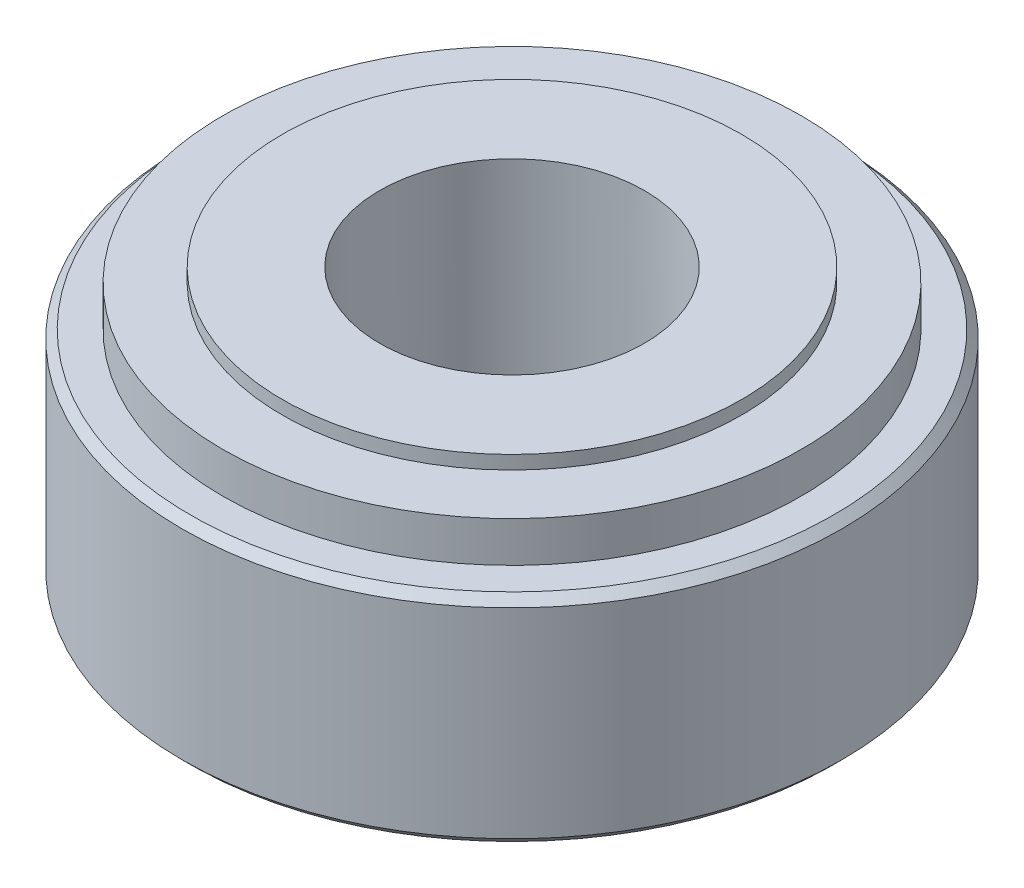
ISO-10303-21;
HEADER;
FILE_DESCRIPTION(('STEP AP214'),'2;1');
FILE_NAME('part.step','',(''),(''),'','','');
FILE_SCHEMA(('AUTOMOTIVE_DESIGN { 1 0 10303 214 1 1 1 1 }'));
ENDSEC;
DATA;
#1=APPLICATION_CONTEXT('core data for automotive mechanical design processes');
#2=APPLICATION_PROTOCOL_DEFINITION('international standard','automotive_design',2000,#1);
#3=PRODUCT_CONTEXT('',#1,'mechanical');
#4=PRODUCT('Part','Part','',(#3));
#5=PRODUCT_RELATED_PRODUCT_CATEGORY('part','',(#4));
#6=PRODUCT_DEFINITION_FORMATION('','',#4);
#7=PRODUCT_DEFINITION_CONTEXT('part definition',#1,'design');
#8=PRODUCT_DEFINITION('design','',#6,#7);
#9=PRODUCT_DEFINITION_SHAPE('','',#8);
#10=(LENGTH_UNIT() NAMED_UNIT(*) SI_UNIT(.MILLI.,.METRE.));
#11=(NAMED_UNIT(*) PLANE_ANGLE_UNIT() SI_UNIT($,.RADIAN.));
#12=(NAMED_UNIT(*) SI_UNIT($,.STERADIAN.) SOLID_ANGLE_UNIT());
#13=UNCERTAINTY_MEASURE_WITH_UNIT(LENGTH_MEASURE(1.E-05),#10,'distance_accuracy_value','');
#14=(GEOMETRIC_REPRESENTATION_CONTEXT(3) GLOBAL_UNCERTAINTY_ASSIGNED_CONTEXT((#13)) GLOBAL_UNIT_ASSIGNED_CONTEXT((#10,
#11,#12)) REPRESENTATION_CONTEXT('',''));
#15=CARTESIAN_POINT('',(0.,0.,0.));
#16=DIRECTION('',(0.,0.,1.));
#17=DIRECTION('',(1.,0.,0.));
#18=AXIS2_PLACEMENT_3D('',#15,#16,#17);
#19=CARTESIAN_POINT('',(0.,89.8155725401987,0.));
#20=DIRECTION('',(0.,1.,0.));
#21=DIRECTION('',(0.,0.,1.));
#22=AXIS2_PLACEMENT_3D('',#19,#20,#21);
#23=PLANE('',#22);
#24=CARTESIAN_POINT('',(0.,89.8155725401987,0.));
#25=DIRECTION('',(0.,-1.,0.));
#26=DIRECTION('',(0.,0.,-1.));
#27=AXIS2_PLACEMENT_3D('',#24,#25,#26);
#28=CIRCLE('',#27,49.);
#29=CARTESIAN_POINT('',(0.,89.8155725401987,-49.));
#30=VERTEX_POINT('',#29);
#31=EDGE_CURVE('E68',#30,#30,#28,.T.);
#32=ORIENTED_EDGE('',*,*,#31,.T.);
#33=EDGE_LOOP('',(#32));
#34=FACE_BOUND('',#33,.T.);
#35=CARTESIAN_POINT('',(0.,89.8155725401986,0.));
#36=DIRECTION('',(0.,-1.,0.));
#37=DIRECTION('',(0.,0.,-1.));
#38=AXIS2_PLACEMENT_3D('',#35,#36,#37);
#39=CIRCLE('',#38,85.);
#40=CARTESIAN_POINT('',(0.,89.8155725401986,-85.));
#41=VERTEX_POINT('',#40);
#42=EDGE_CURVE('E53',#41,#41,#39,.T.);
#43=ORIENTED_EDGE('',*,*,#42,.F.);
#44=EDGE_LOOP('',(#43));
#45=FACE_BOUND('',#44,.T.);
#46=ADVANCED_FACE('F33',(#34,#45),#23,.T.);
#47=CARTESIAN_POINT('',(0.,0.,0.));
#48=DIRECTION('',(0.,-1.,0.));
#49=DIRECTION('',(0.,0.,-1.));
#50=AXIS2_PLACEMENT_3D('',#47,#48,#49);
#51=CYLINDRICAL_SURFACE('',#50,85.);
#52=ORIENTED_EDGE('',*,*,#42,.T.);
#53=EDGE_LOOP('',(#52));
#54=FACE_BOUND('',#53,.T.);
#55=CARTESIAN_POINT('',(0.,84.8155725401987,0.));
#56=DIRECTION('',(0.,-1.,0.));
#57=DIRECTION('',(0.,0.,-1.));
#58=AXIS2_PLACEMENT_3D('',#55,#56,#57);
#59=CIRCLE('',#58,85.);
#60=CARTESIAN_POINT('',(0.,84.8155725401987,-85.));
#61=VERTEX_POINT('',#60);
#62=EDGE_CURVE('E56',#61,#61,#59,.T.);
#63=ORIENTED_EDGE('',*,*,#62,.F.);
#64=EDGE_LOOP('',(#63));
#65=FACE_BOUND('',#64,.T.);
#66=ADVANCED_FACE('F89',(#54,#65),#51,.T.);
#67=CARTESIAN_POINT('',(0.,84.8155725401987,0.));
#68=DIRECTION('',(0.,1.,0.));
#69=DIRECTION('',(0.,0.,1.));
#70=AXIS2_PLACEMENT_3D('',#67,#68,#69);
#71=PLANE('',#70);
#72=ORIENTED_EDGE('',*,*,#62,.T.);
#73=EDGE_LOOP('',(#72));
#74=FACE_BOUND('',#73,.T.);
#75=CARTESIAN_POINT('',(0.,84.8155725401987,0.));
#76=DIRECTION('',(0.,-1.,0.));
#77=DIRECTION('',(0.,0.,-1.));
#78=AXIS2_PLACEMENT_3D('',#75,#76,#77);
#79=CIRCLE('',#78,107.);
#80=CARTESIAN_POINT('',(0.,84.8155725401987,-107.));
#81=VERTEX_POINT('',#80);
#82=EDGE_CURVE('E59',#81,#81,#79,.T.);
#83=ORIENTED_EDGE('',*,*,#82,.F.);
#84=EDGE_LOOP('',(#83));
#85=FACE_BOUND('',#84,.T.);
#86=ADVANCED_FACE('F94',(#74,#85),#71,.T.);
#87=CARTESIAN_POINT('',(0.,0.,0.));
#88=DIRECTION('',(0.,-1.,0.));
#89=DIRECTION('',(0.,0.,-1.));
#90=AXIS2_PLACEMENT_3D('',#87,#88,#89);
#91=CYLINDRICAL_SURFACE('',#90,107.);
#92=CARTESIAN_POINT('',(0.,69.8155725401987,0.));
#93=DIRECTION('',(0.,-1.,0.));
#94=DIRECTION('',(0.,0.,-1.));
#95=AXIS2_PLACEMENT_3D('',#92,#93,#94);
#96=CIRCLE('',#95,107.);
#97=CARTESIAN_POINT('',(0.,69.8155725401987,-107.));
#98=VERTEX_POINT('',#97);
#99=EDGE_CURVE('E62',#98,#98,#96,.T.);
#100=ORIENTED_EDGE('',*,*,#99,.F.);
#101=EDGE_LOOP('',(#100));
#102=FACE_BOUND('',#101,.T.);
#103=ORIENTED_EDGE('',*,*,#82,.T.);
#104=EDGE_LOOP('',(#103));
#105=FACE_BOUND('',#104,.T.);
#106=ADVANCED_FACE('F100',(#102,#105),#91,.T.);
#107=CARTESIAN_POINT('',(0.,69.8155725401987,0.));
#108=DIRECTION('',(0.,-1.,0.));
#109=DIRECTION('',(0.,0.,-1.));
#110=AXIS2_PLACEMENT_3D('',#107,#108,#109);
#111=PLANE('',#110);
#112=CARTESIAN_POINT('',(0.,69.8155725401987,0.));
#113=DIRECTION('',(0.,-1.,0.));
#114=DIRECTION('',(0.,0.,-1.));
#115=AXIS2_PLACEMENT_3D('',#112,#113,#114);
#116=CIRCLE('',#115,119.);
#117=CARTESIAN_POINT('',(0.,69.8155725401987,-119.));
#118=VERTEX_POINT('',#117);
#119=EDGE_CURVE('E10',#118,#118,#116,.F.);
#120=ORIENTED_EDGE('',*,*,#119,.T.);
#121=EDGE_LOOP('',(#120));
#122=FACE_BOUND('',#121,.T.);
#123=ORIENTED_EDGE('',*,*,#99,.T.);
#124=EDGE_LOOP('',(#123));
#125=FACE_BOUND('',#124,.T.);
#126=ADVANCED_FACE('F104',(#122,#125),#111,.F.);
#127=CARTESIAN_POINT('',(0.,0.,0.));
#128=DIRECTION('',(0.,-1.,0.));
#129=DIRECTION('',(0.,0.,-1.));
#130=AXIS2_PLACEMENT_3D('',#127,#128,#129);
#131=CYLINDRICAL_SURFACE('',#130,122.);
#132=CARTESIAN_POINT('',(0.,-7.18442745980138,0.));
#133=DIRECTION('',(0.,-1.,0.));
#134=DIRECTION('',(0.,0.,-1.));
#135=AXIS2_PLACEMENT_3D('',#132,#133,#134);
#136=CIRCLE('',#135,122.);
#137=CARTESIAN_POINT('',(0.,-7.18442745980138,-122.));
#138=VERTEX_POINT('',#137);
#139=EDGE_CURVE('E40',#138,#138,#136,.F.);
#140=ORIENTED_EDGE('',*,*,#139,.T.);
#141=EDGE_LOOP('',(#140));
#142=FACE_BOUND('',#141,.T.);
#143=CARTESIAN_POINT('',(0.,66.8155725401985,0.));
#144=DIRECTION('',(0.,-1.,0.));
#145=DIRECTION('',(0.,0.,-1.));
#146=AXIS2_PLACEMENT_3D('',#143,#144,#145);
#147=CIRCLE('',#146,122.);
#148=CARTESIAN_POINT('',(0.,66.8155725401986,-122.));
#149=VERTEX_POINT('',#148);
#150=EDGE_CURVE('E44',#149,#149,#147,.T.);
#151=ORIENTED_EDGE('',*,*,#150,.T.);
#152=EDGE_LOOP('',(#151));
#153=FACE_BOUND('',#152,.T.);
#154=ADVANCED_FACE('F85',(#142,#153),#131,.T.);
#155=CARTESIAN_POINT('',(0.,-10.1844274598014,0.));
#156=DIRECTION('',(0.,-1.,0.));
#157=DIRECTION('',(0.,0.,-1.));
#158=AXIS2_PLACEMENT_3D('',#155,#156,#157);
#159=PLANE('',#158);
#160=CARTESIAN_POINT('',(0.,-10.1844274598014,0.));
#161=DIRECTION('',(0.,-1.,0.));
#162=DIRECTION('',(0.,0.,-1.));
#163=AXIS2_PLACEMENT_3D('',#160,#161,#162);
#164=CIRCLE('',#163,119.);
#165=CARTESIAN_POINT('',(0.,-10.1844274598014,-119.));
#166=VERTEX_POINT('',#165);
#167=EDGE_CURVE('E48',#166,#166,#164,.T.);
#168=ORIENTED_EDGE('',*,*,#167,.T.);
#169=EDGE_LOOP('',(#168));
#170=FACE_BOUND('',#169,.T.);
#171=CARTESIAN_POINT('',(0.,-10.1844274598014,0.));
#172=DIRECTION('',(0.,-1.,0.));
#173=DIRECTION('',(0.,0.,-1.));
#174=AXIS2_PLACEMENT_3D('',#171,#172,#173);
#175=CIRCLE('',#174,50.7455064928218);
#176=CARTESIAN_POINT('',(0.,-10.1844274598014,-50.7455064928218));
#177=VERTEX_POINT('',#176);
#178=EDGE_CURVE('E65',#177,#177,#175,.T.);
#179=ORIENTED_EDGE('',*,*,#178,.F.);
#180=EDGE_LOOP('',(#179));
#181=FACE_BOUND('',#180,.T.);
#182=ADVANCED_FACE('F77',(#170,#181),#159,.T.);
#183=CARTESIAN_POINT('',(0.,89.8155725401987,0.));
#184=DIRECTION('',(0.,-1.,0.));
#185=DIRECTION('',(0.,0.,-1.));
#186=AXIS2_PLACEMENT_3D('',#183,#184,#185);
#187=CONICAL_SURFACE('',#186,49.,0.0174532925199432);
#188=ORIENTED_EDGE('',*,*,#178,.T.);
#189=EDGE_LOOP('',(#188));
#190=FACE_BOUND('',#189,.T.);
#191=ORIENTED_EDGE('',*,*,#31,.F.);
#192=EDGE_LOOP('',(#191));
#193=FACE_BOUND('',#192,.T.);
#194=ADVANCED_FACE('F74',(#190,#193),#187,.F.);
#195=CARTESIAN_POINT('',(0.,-10.1844274598014,0.));
#196=DIRECTION('',(0.,1.,0.));
#197=DIRECTION('',(0.,0.,1.));
#198=AXIS2_PLACEMENT_3D('',#195,#196,#197);
#199=CONICAL_SURFACE('',#198,119.,0.785398163397441);
#200=ORIENTED_EDGE('',*,*,#139,.F.);
#201=EDGE_LOOP('',(#200));
#202=FACE_BOUND('',#201,.T.);
#203=ORIENTED_EDGE('',*,*,#167,.F.);
#204=EDGE_LOOP('',(#203));
#205=FACE_BOUND('',#204,.T.);
#206=ADVANCED_FACE('F76',(#202,#205),#199,.T.);
#207=CARTESIAN_POINT('',(0.,66.8155725401985,0.));
#208=DIRECTION('',(0.,-1.,0.));
#209=DIRECTION('',(0.,0.,-1.));
#210=AXIS2_PLACEMENT_3D('',#207,#208,#209);
#211=CONICAL_SURFACE('',#210,122.,0.78539816339746);
#212=CARTESIAN_POINT('',(0.,69.8155725401987,-119.));
#213=CARTESIAN_POINT('',(0.,69.7843225401987,-119.03125));
#214=CARTESIAN_POINT('',(0.,69.7530725401987,-119.0625));
#215=CARTESIAN_POINT('',(0.,69.6905725401987,-119.125));
#216=CARTESIAN_POINT('',(0.,69.6593225401987,-119.15625));
#217=CARTESIAN_POINT('',(0.,69.5968225401987,-119.21875));
#218=CARTESIAN_POINT('',(0.,69.5655725401987,-119.25));
#219=CARTESIAN_POINT('',(0.,69.5030725401987,-119.3125));
#220=CARTESIAN_POINT('',(0.,69.4718225401987,-119.34375));
#221=CARTESIAN_POINT('',(0.,69.4093225401987,-119.40625));
#222=CARTESIAN_POINT('',(0.,69.3780725401986,-119.4375));
#223=CARTESIAN_POINT('',(0.,69.3155725401987,-119.5));
#224=CARTESIAN_POINT('',(0.,69.2843225401986,-119.53125));
#225=CARTESIAN_POINT('',(0.,69.2218225401987,-119.59375));
#226=CARTESIAN_POINT('',(0.,69.1905725401986,-119.625));
#227=CARTESIAN_POINT('',(0.,69.1280725401986,-119.6875));
#228=CARTESIAN_POINT('',(0.,69.0968225401986,-119.71875));
#229=CARTESIAN_POINT('',(0.,69.0343225401986,-119.78125));
#230=CARTESIAN_POINT('',(0.,69.0030725401986,-119.8125));
#231=CARTESIAN_POINT('',(0.,68.9405725401986,-119.875));
#232=CARTESIAN_POINT('',(0.,68.9093225401986,-119.90625));
#233=CARTESIAN_POINT('',(0.,68.8468225401986,-119.96875));
#234=CARTESIAN_POINT('',(0.,68.8155725401986,-120.));
#235=CARTESIAN_POINT('',(0.,68.7530725401986,-120.0625));
#236=CARTESIAN_POINT('',(0.,68.7218225401986,-120.09375));
#237=CARTESIAN_POINT('',(0.,68.6593225401986,-120.15625));
#238=CARTESIAN_POINT('',(0.,68.6280725401986,-120.1875));
#239=CARTESIAN_POINT('',(0.,68.5655725401986,-120.25));
#240=CARTESIAN_POINT('',(0.,68.5343225401986,-120.28125));
#241=CARTESIAN_POINT('',(0.,68.4718225401986,-120.34375));
#242=CARTESIAN_POINT('',(0.,68.4405725401986,-120.375));
#243=CARTESIAN_POINT('',(0.,68.3780725401986,-120.4375));
#244=CARTESIAN_POINT('',(0.,68.3468225401986,-120.46875));
#245=CARTESIAN_POINT('',(0.,68.2843225401986,-120.53125));
#246=CARTESIAN_POINT('',(0.,68.2530725401986,-120.5625));
#247=CARTESIAN_POINT('',(0.,68.1905725401986,-120.625));
#248=CARTESIAN_POINT('',(0.,68.1593225401986,-120.65625));
#249=CARTESIAN_POINT('',(0.,68.0968225401986,-120.71875));
#250=CARTESIAN_POINT('',(0.,68.0655725401986,-120.75));
#251=CARTESIAN_POINT('',(0.,68.0030725401986,-120.8125));
#252=CARTESIAN_POINT('',(0.,67.9718225401986,-120.84375));
#253=CARTESIAN_POINT('',(0.,67.9093225401986,-120.90625));
#254=CARTESIAN_POINT('',(0.,67.8780725401986,-120.9375));
#255=CARTESIAN_POINT('',(0.,67.8155725401986,-121.));
#256=CARTESIAN_POINT('',(0.,67.7843225401986,-121.03125));
#257=CARTESIAN_POINT('',(0.,67.7218225401986,-121.09375));
#258=CARTESIAN_POINT('',(0.,67.6905725401986,-121.125));
#259=CARTESIAN_POINT('',(0.,67.6280725401986,-121.1875));
#260=CARTESIAN_POINT('',(0.,67.5968225401986,-121.21875));
#261=CARTESIAN_POINT('',(0.,67.5343225401986,-121.28125));
#262=CARTESIAN_POINT('',(0.,67.5030725401986,-121.3125));
#263=CARTESIAN_POINT('',(0.,67.4405725401986,-121.375));
#264=CARTESIAN_POINT('',(0.,67.4093225401986,-121.40625));
#265=CARTESIAN_POINT('',(0.,67.3468225401986,-121.46875));
#266=CARTESIAN_POINT('',(0.,67.3155725401986,-121.5));
#267=CARTESIAN_POINT('',(0.,67.2530725401986,-121.5625));
#268=CARTESIAN_POINT('',(0.,67.2218225401986,-121.59375));
#269=CARTESIAN_POINT('',(0.,67.1593225401986,-121.65625));
#270=CARTESIAN_POINT('',(0.,67.1280725401985,-121.6875));
#271=CARTESIAN_POINT('',(0.,67.0655725401986,-121.75));
#272=CARTESIAN_POINT('',(0.,67.0343225401985,-121.78125));
#273=CARTESIAN_POINT('',(0.,66.9718225401986,-121.84375));
#274=CARTESIAN_POINT('',(0.,66.9405725401985,-121.875));
#275=CARTESIAN_POINT('',(0.,66.8780725401985,-121.9375));
#276=CARTESIAN_POINT('',(0.,66.8468225401985,-121.96875));
#277=CARTESIAN_POINT('',(0.,66.8155725401985,-122.));
#278=B_SPLINE_CURVE_WITH_KNOTS('',3,(#212,#213,#214,#215,#216,#217,#218,#219,#220,#221,#222,
#223,#224,#225,#226,#227,#228,#229,#230,#231,#232,#233,#234,#235,#236,#237,#238,#239,#240,#241,
#242,#243,#244,#245,#246,#247,#248,#249,#250,#251,#252,#253,#254,#255,#256,#257,#258,#259,#260,
#261,#262,#263,#264,#265,#266,#267,#268,#269,#270,#271,#272,#273,#274,#275,#276,#277),
.UNSPECIFIED.,.F.,.F.,(4,2,2,2,2,2,2,2,2,2,2,2,2,2,2,2,2,2,2,2,2,2,2,2,2,2,2,2,2,2,2,2,4),(0.,
0.132582521472492,0.265165042944975,0.397747564417458,0.530330085889941,0.662912607362423,
0.795495128834906,0.928077650307399,1.06066017177988,1.19324269325236,1.32582521472485,
1.45840773619733,1.59099025766981,1.72357277914229,1.85615530061479,1.98873782208727,
2.12132034355975,2.25390286503224,2.38648538650472,2.5190679079772,2.65165042944969,
2.78423295092218,2.91681547239466,3.04939799386714,3.18198051533963,3.31456303681212,
3.44714555828461,3.57972807975709,3.71231060122958,3.84489312270206,3.97747564417454,
4.11005816564702,4.24264068711951),.UNSPECIFIED.);
#279=EDGE_CURVE('BSEAM35',#118,#149,#278,.T.);
#280=ORIENTED_EDGE('',*,*,#119,.F.);
#281=ORIENTED_EDGE('',*,*,#150,.F.);
#282=ORIENTED_EDGE('',*,*,#279,.T.);
#283=ORIENTED_EDGE('',*,*,#279,.F.);
#284=EDGE_LOOP('',(#280,#282,#281,#283));
#285=FACE_BOUND('',#284,.T.);
#286=ADVANCED_FACE('F35',(#285),#211,.T.);
#287=CLOSED_SHELL('',(#46,#66,#86,#106,#126,#154,#182,#194,#206,#286));
#288=MANIFOLD_SOLID_BREP('B2',#287);
#289=ADVANCED_BREP_SHAPE_REPRESENTATION('',(#18,#288),#14);
#290=SHAPE_DEFINITION_REPRESENTATION(#9,#289);
ENDSEC;
END-ISO-10303-21;
